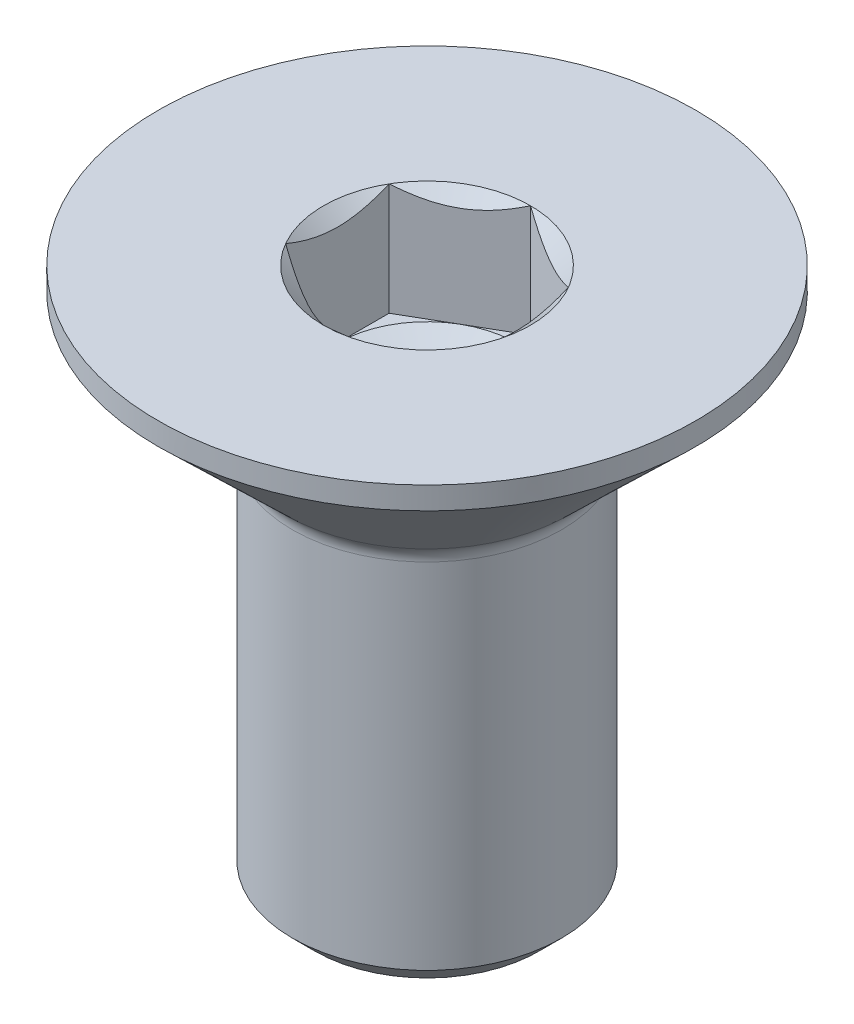
ISO-10303-21;
HEADER;
FILE_DESCRIPTION(('STEP AP214'),'2;1');
FILE_NAME('part.step','',(''),(''),'','','');
FILE_SCHEMA(('AUTOMOTIVE_DESIGN { 1 0 10303 214 1 1 1 1 }'));
ENDSEC;
DATA;
#1=APPLICATION_CONTEXT('core data for automotive mechanical design processes');
#2=APPLICATION_PROTOCOL_DEFINITION('international standard','automotive_design',2000,#1);
#3=PRODUCT_CONTEXT('',#1,'mechanical');
#4=PRODUCT('Part','Part','',(#3));
#5=PRODUCT_RELATED_PRODUCT_CATEGORY('part','',(#4));
#6=PRODUCT_DEFINITION_FORMATION('','',#4);
#7=PRODUCT_DEFINITION_CONTEXT('part definition',#1,'design');
#8=PRODUCT_DEFINITION('design','',#6,#7);
#9=PRODUCT_DEFINITION_SHAPE('','',#8);
#10=(LENGTH_UNIT() NAMED_UNIT(*) SI_UNIT(.MILLI.,.METRE.));
#11=(NAMED_UNIT(*) PLANE_ANGLE_UNIT() SI_UNIT($,.RADIAN.));
#12=(NAMED_UNIT(*) SI_UNIT($,.STERADIAN.) SOLID_ANGLE_UNIT());
#13=UNCERTAINTY_MEASURE_WITH_UNIT(LENGTH_MEASURE(1.E-05),#10,'distance_accuracy_value','');
#14=(GEOMETRIC_REPRESENTATION_CONTEXT(3) GLOBAL_UNCERTAINTY_ASSIGNED_CONTEXT((#13)) GLOBAL_UNIT_ASSIGNED_CONTEXT((#10,
#11,#12)) REPRESENTATION_CONTEXT('',''));
#15=CARTESIAN_POINT('',(0.,0.,0.));
#16=DIRECTION('',(0.,0.,1.));
#17=DIRECTION('',(1.,0.,0.));
#18=AXIS2_PLACEMENT_3D('',#15,#16,#17);
#19=CARTESIAN_POINT('',(0.,0.,0.));
#20=DIRECTION('',(0.,-1.,0.));
#21=DIRECTION('',(0.,0.,-1.));
#22=AXIS2_PLACEMENT_3D('',#19,#20,#21);
#23=PLANE('',#22);
#24=CARTESIAN_POINT('',(0.,0.,0.));
#25=DIRECTION('',(0.,1.,0.));
#26=DIRECTION('',(0.,0.,1.));
#27=AXIS2_PLACEMENT_3D('',#24,#25,#26);
#28=CIRCLE('',#27,2.31);
#29=CARTESIAN_POINT('',(0.,0.,2.31));
#30=VERTEX_POINT('',#29);
#31=EDGE_CURVE('E128',#30,#30,#28,.T.);
#32=ORIENTED_EDGE('',*,*,#31,.F.);
#33=EDGE_LOOP('',(#32));
#34=FACE_BOUND('',#33,.T.);
#35=CARTESIAN_POINT('',(0.,0.,0.));
#36=DIRECTION('',(0.,-1.,0.));
#37=DIRECTION('',(0.,0.,-1.));
#38=AXIS2_PLACEMENT_3D('',#35,#36,#37);
#39=CIRCLE('',#38,6.);
#40=CARTESIAN_POINT('',(0.,0.,-6.));
#41=VERTEX_POINT('',#40);
#42=EDGE_CURVE('E174',#41,#41,#39,.T.);
#43=ORIENTED_EDGE('',*,*,#42,.F.);
#44=EDGE_LOOP('',(#43));
#45=FACE_BOUND('',#44,.T.);
#46=ADVANCED_FACE('F40',(#34,#45),#23,.F.);
#47=CARTESIAN_POINT('',(0.,0.,0.));
#48=DIRECTION('',(0.,-1.,0.));
#49=DIRECTION('',(0.,0.,-1.));
#50=AXIS2_PLACEMENT_3D('',#47,#48,#49);
#51=CYLINDRICAL_SURFACE('',#50,6.);
#52=CARTESIAN_POINT('',(0.,-0.500000000000001,0.));
#53=DIRECTION('',(0.,-1.,0.));
#54=DIRECTION('',(0.,0.,-1.));
#55=AXIS2_PLACEMENT_3D('',#52,#53,#54);
#56=CIRCLE('',#55,6.);
#57=CARTESIAN_POINT('',(0.,-0.500000000000001,-6.));
#58=VERTEX_POINT('',#57);
#59=EDGE_CURVE('E161',#58,#58,#56,.T.);
#60=ORIENTED_EDGE('',*,*,#59,.F.);
#61=EDGE_LOOP('',(#60));
#62=FACE_BOUND('',#61,.T.);
#63=ORIENTED_EDGE('',*,*,#42,.T.);
#64=EDGE_LOOP('',(#63));
#65=FACE_BOUND('',#64,.T.);
#66=ADVANCED_FACE('F261',(#62,#65),#51,.T.);
#67=CARTESIAN_POINT('',(0.,-0.500000000000001,0.));
#68=DIRECTION('',(0.,1.,0.));
#69=DIRECTION('',(0.,0.,1.));
#70=AXIS2_PLACEMENT_3D('',#67,#68,#69);
#71=CONICAL_SURFACE('',#70,6.,0.802851455917386);
#72=CARTESIAN_POINT('',(0.,-3.24963383235673,0.));
#73=DIRECTION('',(0.,1.,0.));
#74=DIRECTION('',(0.,0.,1.));
#75=AXIS2_PLACEMENT_3D('',#72,#73,#74);
#76=CIRCLE('',#75,3.1526708147705);
#77=CARTESIAN_POINT('',(0.,-3.24963383235673,3.1526708147705));
#78=VERTEX_POINT('',#77);
#79=EDGE_CURVE('E282',#78,#78,#76,.T.);
#80=ORIENTED_EDGE('',*,*,#79,.T.);
#81=EDGE_LOOP('',(#80));
#82=FACE_BOUND('',#81,.T.);
#83=ORIENTED_EDGE('',*,*,#59,.T.);
#84=EDGE_LOOP('',(#83));
#85=FACE_BOUND('',#84,.T.);
#86=ADVANCED_FACE('F267',(#82,#85),#71,.T.);
#87=CARTESIAN_POINT('',(0.,0.,0.));
#88=DIRECTION('',(0.,-1.,0.));
#89=DIRECTION('',(0.,0.,-1.));
#90=AXIS2_PLACEMENT_3D('',#87,#88,#89);
#91=CYLINDRICAL_SURFACE('',#90,3.);
#92=CARTESIAN_POINT('',(0.,-11.5,0.));
#93=DIRECTION('',(0.,1.,0.));
#94=DIRECTION('',(0.,0.,1.));
#95=AXIS2_PLACEMENT_3D('',#92,#93,#94);
#96=CIRCLE('',#95,3.);
#97=CARTESIAN_POINT('',(0.,-11.5,3.));
#98=VERTEX_POINT('',#97);
#99=EDGE_CURVE('E11',#98,#98,#96,.T.);
#100=ORIENTED_EDGE('',*,*,#99,.T.);
#101=EDGE_LOOP('',(#100));
#102=FACE_BOUND('',#101,.T.);
#103=CARTESIAN_POINT('',(0.,-3.60930373252606,0.));
#104=DIRECTION('',(0.,-1.,0.));
#105=DIRECTION('',(0.,0.,-1.));
#106=AXIS2_PLACEMENT_3D('',#103,#104,#105);
#107=CIRCLE('',#106,3.);
#108=CARTESIAN_POINT('',(0.,-3.60930373252606,-3.));
#109=VERTEX_POINT('',#108);
#110=EDGE_CURVE('E184',#109,#109,#107,.T.);
#111=ORIENTED_EDGE('',*,*,#110,.T.);
#112=EDGE_LOOP('',(#111));
#113=FACE_BOUND('',#112,.T.);
#114=ADVANCED_FACE('F292',(#102,#113),#91,.T.);
#115=CARTESIAN_POINT('',(-3.,-12.,0.));
#116=DIRECTION('',(0.,1.,0.));
#117=DIRECTION('',(0.,0.,1.));
#118=AXIS2_PLACEMENT_3D('',#115,#116,#117);
#119=PLANE('',#118);
#120=CARTESIAN_POINT('',(0.,-12.,0.));
#121=DIRECTION('',(0.,1.,0.));
#122=DIRECTION('',(0.,0.,1.));
#123=AXIS2_PLACEMENT_3D('',#120,#121,#122);
#124=CIRCLE('',#123,2.5);
#125=CARTESIAN_POINT('',(0.,-12.,2.5));
#126=VERTEX_POINT('',#125);
#127=EDGE_CURVE('E49',#126,#126,#124,.F.);
#128=ORIENTED_EDGE('',*,*,#127,.T.);
#129=EDGE_LOOP('',(#128));
#130=FACE_BOUND('',#129,.T.);
#131=ADVANCED_FACE('F194',(#130),#119,.F.);
#132=CARTESIAN_POINT('',(0.,0.,0.));
#133=DIRECTION('',(0.,1.,0.));
#134=DIRECTION('',(0.,0.,1.));
#135=AXIS2_PLACEMENT_3D('',#132,#133,#134);
#136=CONICAL_SURFACE('',#135,2.31,0.872664625997163);
#137=ORIENTED_EDGE('',*,*,#31,.T.);
#138=EDGE_LOOP('',(#137));
#139=FACE_BOUND('',#138,.T.);
#140=CARTESIAN_POINT('',(-2.0002,-0.000405658125004433,1.15458506832541));
#141=CARTESIAN_POINT('',(-1.93287475094144,-0.0330095781407986,1.19345531899263));
#142=CARTESIAN_POINT('',(-1.86472971647742,-0.0635756724591018,1.23279887298437));
#143=CARTESIAN_POINT('',(-1.72660712740608,-0.119456092610079,1.31254398696588));
#144=CARTESIAN_POINT('',(-1.65662434741183,-0.144753068593469,1.3529485638342));
#145=CARTESIAN_POINT('',(-1.51571866742109,-0.188489926028671,1.4343004961072));
#146=CARTESIAN_POINT('',(-1.44481025262435,-0.206990500953071,1.4752394884779));
#147=CARTESIAN_POINT('',(-1.30186028885634,-0.236167725831299,1.55777168854001));
#148=CARTESIAN_POINT('',(-1.22982023312787,-0.246853924869292,1.59936403410728));
#149=CARTESIAN_POINT('',(-1.0839081689999,-0.259651331980527,1.68360640360958));
#150=CARTESIAN_POINT('',(-1.01002594981363,-0.261612076482138,1.7262623227451));
#151=CARTESIAN_POINT('',(-0.862481355207968,-0.256357289574613,1.81144723415815));
#152=CARTESIAN_POINT('',(-0.788819091111622,-0.249137710941465,1.85397616216329));
#153=CARTESIAN_POINT('',(-0.642524118308169,-0.226181336942714,1.93843960409246));
#154=CARTESIAN_POINT('',(-0.569891412688498,-0.210444516041176,1.98037411623394));
#155=CARTESIAN_POINT('',(-0.426099536377414,-0.17166610345073,2.06339239472943));
#156=CARTESIAN_POINT('',(-0.354941007253609,-0.148621399648175,2.1044757906742));
#157=CARTESIAN_POINT('',(-0.236290739707517,-0.104738038853124,2.17297855458135));
#158=CARTESIAN_POINT('',(-0.188354292269175,-0.0854616753332946,2.20065467541387));
#159=CARTESIAN_POINT('',(-0.0934234004944906,-0.0445838493235726,2.2554630513344));
#160=CARTESIAN_POINT('',(-0.0464262009270026,-0.022990946362807,2.28259689715585));
#161=CARTESIAN_POINT('',(0.000200000000027821,-0.000405658125105898,2.30951654681236));
#162=B_SPLINE_CURVE_WITH_KNOTS('',3,(#140,#141,#142,#143,#144,#145,#146,#147,#148,#149,#150,
#151,#152,#153,#154,#155,#156,#157,#158,#159,#160,#161),.UNSPECIFIED.,.F.,.F.,(4,2,2,2,2,2,2,2,
2,2,4),(0.,0.253000866314928,0.506822070483019,0.758318072154043,1.00950623246608,
1.2650095573224,1.52062556206819,1.77624233319228,2.03196810704139,2.20775392381176,
2.38291123945846),.UNSPECIFIED.);
#163=CARTESIAN_POINT('',(-2.,-0.00050255627104479,1.15470053837925));
#164=VERTEX_POINT('',#163);
#165=CARTESIAN_POINT('',(0.,-0.000502556271044343,2.3094010767585));
#166=VERTEX_POINT('',#165);
#167=EDGE_CURVE('E217',#164,#166,#162,.T.);
#168=ORIENTED_EDGE('',*,*,#167,.F.);
#169=CARTESIAN_POINT('',(-2.,1.42884136912728,-3.47890488615756));
#170=CARTESIAN_POINT('',(-2.,1.34383784002477,-3.36198935419755));
#171=CARTESIAN_POINT('',(-2.,1.25946562552995,-3.24460158772741));
#172=CARTESIAN_POINT('',(-2.,1.09251673958674,-3.00845232159265));
#173=CARTESIAN_POINT('',(-2.,1.0099411791052,-2.88969003782471));
#174=CARTESIAN_POINT('',(-2.,0.842987100749887,-2.64427692856581));
#175=CARTESIAN_POINT('',(-2.,0.758738482512587,-2.51753727508831));
#176=CARTESIAN_POINT('',(-2.,0.594062136943071,-2.26162364876202));
#177=CARTESIAN_POINT('',(-2.,0.513633452735371,-2.13245029698778));
#178=CARTESIAN_POINT('',(-2.,0.358016091222403,-1.87028891857478));
#179=CARTESIAN_POINT('',(-2.,0.282848711244451,-1.73728815327162));
#180=CARTESIAN_POINT('',(-2.,0.140834225934501,-1.46659435801191));
#181=CARTESIAN_POINT('',(-2.,0.0739963282907944,-1.32889634593875));
#182=CARTESIAN_POINT('',(-2.,-0.0156240795056579,-1.1197610729532));
#183=CARTESIAN_POINT('',(-2.,-0.0434434617845949,-1.05048990390851));
#184=CARTESIAN_POINT('',(-2.,-0.0951627305639261,-0.910474599859307));
#185=CARTESIAN_POINT('',(-2.,-0.119062239058122,-0.839730323538723));
#186=CARTESIAN_POINT('',(-2.,-0.162015759690175,-0.696965221013769));
#187=CARTESIAN_POINT('',(-2.,-0.181082115130939,-0.62494815956037));
#188=CARTESIAN_POINT('',(-2.,-0.213530543822554,-0.479663688822512));
#189=CARTESIAN_POINT('',(-2.,-0.226915469126224,-0.406396926142935));
#190=CARTESIAN_POINT('',(-2.,-0.248207044817011,-0.251712538215383));
#191=CARTESIAN_POINT('',(-2.,-0.25544750416034,-0.170200374129012));
#192=CARTESIAN_POINT('',(-2.,-0.26150785060429,-0.00685365619545706));
#193=CARTESIAN_POINT('',(-2.,-0.260327332124292,0.0749809129900447));
#194=CARTESIAN_POINT('',(-2.,-0.249629928206385,0.238392939894142));
#195=CARTESIAN_POINT('',(-2.,-0.240082440695584,0.319968349370142));
#196=CARTESIAN_POINT('',(-2.,-0.21338938373544,0.481853646739431));
#197=CARTESIAN_POINT('',(-2.,-0.196241879568789,0.562163206994297));
#198=CARTESIAN_POINT('',(-2.,-0.145736850275507,0.759207540378743));
#199=CARTESIAN_POINT('',(-2.,-0.108549130230999,0.874951900557049));
#200=CARTESIAN_POINT('',(-2.,-0.0239058600067478,1.10260962747161));
#201=CARTESIAN_POINT('',(-2.,0.0235598353258809,1.21451908153173));
#202=CARTESIAN_POINT('',(-2.,0.126199638300027,1.43602356741974));
#203=CARTESIAN_POINT('',(-2.,0.181444608973065,1.54558525042221));
#204=CARTESIAN_POINT('',(-2.,0.297090375927768,1.76185641556556));
#205=CARTESIAN_POINT('',(-2.,0.357489005146713,1.86856707199062));
#206=CARTESIAN_POINT('',(-2.,0.497538965732064,2.10616377702059));
#207=CARTESIAN_POINT('',(-2.,0.57823147229585,2.23643202919733));
#208=CARTESIAN_POINT('',(-2.,0.743573557452137,2.49445789741069));
#209=CARTESIAN_POINT('',(-2.,0.828224204652483,2.62221482206816));
#210=CARTESIAN_POINT('',(-2.,0.997865444974068,2.87223713301826));
#211=CARTESIAN_POINT('',(-2.,1.08277833262734,2.99455551226823));
#212=CARTESIAN_POINT('',(-2.,1.25452118355681,3.23771611889464));
#213=CARTESIAN_POINT('',(-2.,1.34134979637811,3.35855929837634));
#214=CARTESIAN_POINT('',(-2.,1.42884136912727,3.47890488615756));
#215=B_SPLINE_CURVE_WITH_KNOTS('',3,(#169,#170,#171,#172,#173,#174,#175,#176,#177,#178,#179,
#180,#181,#182,#183,#184,#185,#186,#187,#188,#189,#190,#191,#192,#193,#194,#195,#196,#197,#198,
#199,#200,#201,#202,#203,#204,#205,#206,#207,#208,#209,#210,#211,#212,#213,#214),.UNSPECIFIED.,
.F.,.F.,(4,2,2,2,2,2,2,2,2,2,2,2,2,2,2,2,2,2,2,2,2,2,4),(0.,0.433665424759704,0.86759179566553,
1.3241059282744,1.78050509651411,2.23865603748475,2.69730902414555,2.92116305046455,
3.1450386510805,3.36833660490576,3.59152233119441,3.83660150247801,4.08169247762035,
4.32768362845525,4.57373743664443,4.93772255085633,5.30206859763893,5.66997874286225,
6.03773494074744,6.49733214724377,6.95705415914102,7.40374015680396,7.85012074247862),.UNSPECIFIED.);
#216=CARTESIAN_POINT('',(-2.,-0.000502556271044633,-1.15470053837925));
#217=VERTEX_POINT('',#216);
#218=EDGE_CURVE('E56',#217,#164,#215,.T.);
#219=ORIENTED_EDGE('',*,*,#218,.F.);
#220=CARTESIAN_POINT('',(0.000200000000000059,-0.000405658125004177,-2.30951654681234));
#221=CARTESIAN_POINT('',(-0.0671252490585628,-0.0330095781407983,-2.27064629614512));
#222=CARTESIAN_POINT('',(-0.135270283522582,-0.0635756724591017,-2.23130274215338));
#223=CARTESIAN_POINT('',(-0.273392872593922,-0.119456092610079,-2.15155762817188));
#224=CARTESIAN_POINT('',(-0.343375652588173,-0.144753068593469,-2.11115305130356));
#225=CARTESIAN_POINT('',(-0.484281332578911,-0.188489926028671,-2.02980111903056));
#226=CARTESIAN_POINT('',(-0.555189747375652,-0.206990500953071,-1.98886212665985));
#227=CARTESIAN_POINT('',(-0.698139711143656,-0.236167725831299,-1.90632992659775));
#228=CARTESIAN_POINT('',(-0.770179766872132,-0.246853924869291,-1.86473758103048));
#229=CARTESIAN_POINT('',(-0.916091831000098,-0.259651331980526,-1.78049521152818));
#230=CARTESIAN_POINT('',(-0.989974050186368,-0.261612076482139,-1.73783929239266));
#231=CARTESIAN_POINT('',(-1.13751864479203,-0.256357289574613,-1.65265438097961));
#232=CARTESIAN_POINT('',(-1.21118090888838,-0.249137710941465,-1.61012545297446));
#233=CARTESIAN_POINT('',(-1.35747588169183,-0.226181336942714,-1.5256620110453));
#234=CARTESIAN_POINT('',(-1.4301085873115,-0.210444516041176,-1.48372749890381));
#235=CARTESIAN_POINT('',(-1.57390046362259,-0.17166610345073,-1.40070922040833));
#236=CARTESIAN_POINT('',(-1.64505899274639,-0.148621399648176,-1.35962582446356));
#237=CARTESIAN_POINT('',(-1.76370926029248,-0.104738038853124,-1.2911230605564));
#238=CARTESIAN_POINT('',(-1.81164570773083,-0.0854616753332948,-1.26344693972388));
#239=CARTESIAN_POINT('',(-1.90657659950551,-0.0445838493235729,-1.20863856380336));
#240=CARTESIAN_POINT('',(-1.953573799073,-0.0229909463628074,-1.18150471798191));
#241=CARTESIAN_POINT('',(-2.00020000000003,-0.000405658125106367,-1.1545850683254));
#242=B_SPLINE_CURVE_WITH_KNOTS('',3,(#220,#221,#222,#223,#224,#225,#226,#227,#228,#229,#230,
#231,#232,#233,#234,#235,#236,#237,#238,#239,#240,#241),.UNSPECIFIED.,.F.,.F.,(4,2,2,2,2,2,2,2,
2,2,4),(0.,0.253000866314929,0.506822070483019,0.758318072154043,1.00950623246608,
1.2650095573224,1.52062556206819,1.77624233319228,2.03196810704139,2.20775392381176,
2.38291123945846),.UNSPECIFIED.);
#243=CARTESIAN_POINT('',(0.,-0.000502556271044336,-2.3094010767585));
#244=VERTEX_POINT('',#243);
#245=EDGE_CURVE('E138',#244,#217,#242,.T.);
#246=ORIENTED_EDGE('',*,*,#245,.F.);
#247=CARTESIAN_POINT('',(2.0002,-0.000405658125004795,-1.15458506832541));
#248=CARTESIAN_POINT('',(1.93287475094144,-0.0330095781407987,-1.19345531899263));
#249=CARTESIAN_POINT('',(1.86472971647742,-0.0635756724591018,-1.23279887298437));
#250=CARTESIAN_POINT('',(1.72660712740608,-0.119456092610079,-1.31254398696588));
#251=CARTESIAN_POINT('',(1.65662434741183,-0.144753068593469,-1.3529485638342));
#252=CARTESIAN_POINT('',(1.51571866742109,-0.188489926028671,-1.4343004961072));
#253=CARTESIAN_POINT('',(1.44481025262435,-0.206990500953071,-1.47523948847791));
#254=CARTESIAN_POINT('',(1.30186028885634,-0.236167725831299,-1.55777168854001));
#255=CARTESIAN_POINT('',(1.22982023312787,-0.246853924869291,-1.59936403410728));
#256=CARTESIAN_POINT('',(1.0839081689999,-0.259651331980526,-1.68360640360958));
#257=CARTESIAN_POINT('',(1.01002594981363,-0.261612076482138,-1.7262623227451));
#258=CARTESIAN_POINT('',(0.862481355207967,-0.256357289574612,-1.81144723415815));
#259=CARTESIAN_POINT('',(0.788819091111622,-0.249137710941465,-1.85397616216329));
#260=CARTESIAN_POINT('',(0.642524118308169,-0.226181336942714,-1.93843960409246));
#261=CARTESIAN_POINT('',(0.569891412688498,-0.210444516041176,-1.98037411623394));
#262=CARTESIAN_POINT('',(0.426099536377414,-0.17166610345073,-2.06339239472943));
#263=CARTESIAN_POINT('',(0.354941007253609,-0.148621399648175,-2.1044757906742));
#264=CARTESIAN_POINT('',(0.236290739707517,-0.104738038853124,-2.17297855458135));
#265=CARTESIAN_POINT('',(0.188354292269175,-0.0854616753332948,-2.20065467541387));
#266=CARTESIAN_POINT('',(0.0934234004944905,-0.0445838493235729,-2.2554630513344));
#267=CARTESIAN_POINT('',(0.0464262009270024,-0.0229909463628073,-2.28259689715585));
#268=CARTESIAN_POINT('',(-0.000200000000028158,-0.000405658125106044,-2.30951654681236));
#269=B_SPLINE_CURVE_WITH_KNOTS('',3,(#247,#248,#249,#250,#251,#252,#253,#254,#255,#256,#257,
#258,#259,#260,#261,#262,#263,#264,#265,#266,#267,#268),.UNSPECIFIED.,.F.,.F.,(4,2,2,2,2,2,2,2,
2,2,4),(0.,0.253000866314928,0.506822070483018,0.758318072154043,1.00950623246608,
1.2650095573224,1.52062556206819,1.77624233319228,2.03196810704139,2.20775392381176,
2.38291123945846),.UNSPECIFIED.);
#270=CARTESIAN_POINT('',(2.,-0.000502556271044776,-1.15470053837925));
#271=VERTEX_POINT('',#270);
#272=EDGE_CURVE('E211',#271,#244,#269,.T.);
#273=ORIENTED_EDGE('',*,*,#272,.F.);
#274=CARTESIAN_POINT('',(2.,1.42884136912728,3.47890488615756));
#275=CARTESIAN_POINT('',(2.,1.34383784002477,3.36198935419755));
#276=CARTESIAN_POINT('',(2.,1.25946562552996,3.24460158772742));
#277=CARTESIAN_POINT('',(2.,1.09251673958674,3.00845232159265));
#278=CARTESIAN_POINT('',(2.,1.0099411791052,2.88969003782471));
#279=CARTESIAN_POINT('',(2.,0.842987100749888,2.64427692856582));
#280=CARTESIAN_POINT('',(2.,0.758738482512587,2.51753727508831));
#281=CARTESIAN_POINT('',(2.,0.594062136943072,2.26162364876202));
#282=CARTESIAN_POINT('',(2.,0.513633452735372,2.13245029698778));
#283=CARTESIAN_POINT('',(2.,0.358016091222403,1.87028891857478));
#284=CARTESIAN_POINT('',(2.,0.282848711244451,1.73728815327162));
#285=CARTESIAN_POINT('',(2.,0.140834225934501,1.46659435801191));
#286=CARTESIAN_POINT('',(2.,0.0739963282907947,1.32889634593875));
#287=CARTESIAN_POINT('',(2.,-0.015624079505658,1.1197610729532));
#288=CARTESIAN_POINT('',(2.,-0.0434434617845952,1.05048990390851));
#289=CARTESIAN_POINT('',(2.,-0.0951627305639264,0.910474599859307));
#290=CARTESIAN_POINT('',(2.,-0.119062239058122,0.839730323538723));
#291=CARTESIAN_POINT('',(2.,-0.162015759690175,0.696965221013769));
#292=CARTESIAN_POINT('',(2.,-0.181082115130939,0.624948159560369));
#293=CARTESIAN_POINT('',(2.,-0.213530543822554,0.479663688822512));
#294=CARTESIAN_POINT('',(2.,-0.226915469126224,0.406396926142935));
#295=CARTESIAN_POINT('',(2.,-0.248207044817011,0.251712538215382));
#296=CARTESIAN_POINT('',(2.,-0.25544750416034,0.170200374129011));
#297=CARTESIAN_POINT('',(2.,-0.26150785060429,0.00685365619545654));
#298=CARTESIAN_POINT('',(2.,-0.260327332124292,-0.0749809129900453));
#299=CARTESIAN_POINT('',(2.,-0.249629928206385,-0.238392939894143));
#300=CARTESIAN_POINT('',(2.,-0.240082440695584,-0.319968349370143));
#301=CARTESIAN_POINT('',(2.,-0.21338938373544,-0.481853646739432));
#302=CARTESIAN_POINT('',(2.,-0.196241879568789,-0.562163206994298));
#303=CARTESIAN_POINT('',(2.,-0.145736850275507,-0.759207540378743));
#304=CARTESIAN_POINT('',(2.,-0.108549130230999,-0.87495190055705));
#305=CARTESIAN_POINT('',(2.,-0.0239058600067477,-1.10260962747161));
#306=CARTESIAN_POINT('',(2.,0.0235598353258809,-1.21451908153173));
#307=CARTESIAN_POINT('',(2.,0.126199638300027,-1.43602356741974));
#308=CARTESIAN_POINT('',(2.,0.181444608973064,-1.54558525042221));
#309=CARTESIAN_POINT('',(2.,0.297090375927769,-1.76185641556556));
#310=CARTESIAN_POINT('',(2.,0.357489005146713,-1.86856707199062));
#311=CARTESIAN_POINT('',(2.,0.497538965732065,-2.10616377702059));
#312=CARTESIAN_POINT('',(2.,0.57823147229585,-2.23643202919733));
#313=CARTESIAN_POINT('',(2.,0.743573557452138,-2.49445789741069));
#314=CARTESIAN_POINT('',(2.,0.828224204652484,-2.62221482206817));
#315=CARTESIAN_POINT('',(2.,0.997865444974069,-2.87223713301826));
#316=CARTESIAN_POINT('',(2.,1.08277833262734,-2.99455551226823));
#317=CARTESIAN_POINT('',(2.,1.25452118355681,-3.23771611889464));
#318=CARTESIAN_POINT('',(2.,1.34134979637811,-3.35855929837634));
#319=CARTESIAN_POINT('',(2.,1.42884136912728,-3.47890488615756));
#320=B_SPLINE_CURVE_WITH_KNOTS('',3,(#274,#275,#276,#277,#278,#279,#280,#281,#282,#283,#284,
#285,#286,#287,#288,#289,#290,#291,#292,#293,#294,#295,#296,#297,#298,#299,#300,#301,#302,#303,
#304,#305,#306,#307,#308,#309,#310,#311,#312,#313,#314,#315,#316,#317,#318,#319),.UNSPECIFIED.,
.F.,.F.,(4,2,2,2,2,2,2,2,2,2,2,2,2,2,2,2,2,2,2,2,2,2,4),(0.,0.433665424759705,0.86759179566553,
1.3241059282744,1.78050509651412,2.23865603748475,2.69730902414556,2.92116305046456,
3.1450386510805,3.36833660490576,3.59152233119442,3.83660150247801,4.08169247762036,
4.32768362845526,4.57373743664444,4.93772255085633,5.30206859763893,5.66997874286225,
6.03773494074744,6.49733214724377,6.95705415914102,7.40374015680396,7.85012074247862),.UNSPECIFIED.);
#321=CARTESIAN_POINT('',(2.,-0.000502556271044359,1.15470053837925));
#322=VERTEX_POINT('',#321);
#323=EDGE_CURVE('E224',#322,#271,#320,.T.);
#324=ORIENTED_EDGE('',*,*,#323,.F.);
#325=CARTESIAN_POINT('',(-0.000200000000000382,-0.000405658125004177,2.30951654681234));
#326=CARTESIAN_POINT('',(0.0671252490585623,-0.0330095781407984,2.27064629614512));
#327=CARTESIAN_POINT('',(0.135270283522581,-0.0635756724591017,2.23130274215338));
#328=CARTESIAN_POINT('',(0.273392872593922,-0.119456092610079,2.15155762817188));
#329=CARTESIAN_POINT('',(0.343375652588173,-0.144753068593468,2.11115305130356));
#330=CARTESIAN_POINT('',(0.484281332578911,-0.188489926028671,2.02980111903056));
#331=CARTESIAN_POINT('',(0.555189747375652,-0.206990500953071,1.98886212665985));
#332=CARTESIAN_POINT('',(0.698139711143655,-0.236167725831299,1.90632992659775));
#333=CARTESIAN_POINT('',(0.770179766872131,-0.246853924869291,1.86473758103048));
#334=CARTESIAN_POINT('',(0.916091831000098,-0.259651331980526,1.78049521152818));
#335=CARTESIAN_POINT('',(0.989974050186367,-0.261612076482138,1.73783929239266));
#336=CARTESIAN_POINT('',(1.13751864479203,-0.256357289574613,1.65265438097961));
#337=CARTESIAN_POINT('',(1.21118090888838,-0.249137710941465,1.61012545297446));
#338=CARTESIAN_POINT('',(1.35747588169183,-0.226181336942714,1.5256620110453));
#339=CARTESIAN_POINT('',(1.4301085873115,-0.210444516041176,1.48372749890381));
#340=CARTESIAN_POINT('',(1.57390046362259,-0.17166610345073,1.40070922040833));
#341=CARTESIAN_POINT('',(1.64505899274639,-0.148621399648175,1.35962582446356));
#342=CARTESIAN_POINT('',(1.76370926029248,-0.104738038853124,1.2911230605564));
#343=CARTESIAN_POINT('',(1.81164570773082,-0.085461675333295,1.26344693972388));
#344=CARTESIAN_POINT('',(1.90657659950551,-0.044583849323573,1.20863856380336));
#345=CARTESIAN_POINT('',(1.953573799073,-0.0229909463628073,1.18150471798191));
#346=CARTESIAN_POINT('',(2.00020000000003,-0.000405658125105825,1.1545850683254));
#347=B_SPLINE_CURVE_WITH_KNOTS('',3,(#325,#326,#327,#328,#329,#330,#331,#332,#333,#334,#335,
#336,#337,#338,#339,#340,#341,#342,#343,#344,#345,#346),.UNSPECIFIED.,.F.,.F.,(4,2,2,2,2,2,2,2,
2,2,4),(0.,0.253000866314929,0.506822070483019,0.758318072154043,1.00950623246608,
1.2650095573224,1.52062556206819,1.77624233319228,2.03196810704139,2.20775392381176,
2.38291123945846),.UNSPECIFIED.);
#348=EDGE_CURVE('E229',#166,#322,#347,.T.);
#349=ORIENTED_EDGE('',*,*,#348,.F.);
#350=EDGE_LOOP('',(#168,#219,#246,#273,#324,#349));
#351=FACE_BOUND('',#350,.T.);
#352=ADVANCED_FACE('F190',(#139,#351),#136,.F.);
#353=CARTESIAN_POINT('',(0.,-2.5,0.));
#354=DIRECTION('',(0.,1.,0.));
#355=DIRECTION('',(0.,0.,1.));
#356=AXIS2_PLACEMENT_3D('',#353,#354,#355);
#357=PLANE('',#356);
#358=CARTESIAN_POINT('',(0.,-2.5,0.));
#359=DIRECTION('',(0.,1.,0.));
#360=DIRECTION('',(0.,0.,1.));
#361=AXIS2_PLACEMENT_3D('',#358,#359,#360);
#362=CIRCLE('',#361,2.);
#363=CARTESIAN_POINT('',(2.,-2.5,0.));
#364=VERTEX_POINT('',#363);
#365=CARTESIAN_POINT('',(1.,-2.5,-1.73205080756888));
#366=VERTEX_POINT('',#365);
#367=EDGE_CURVE('E122',#364,#366,#362,.T.);
#368=ORIENTED_EDGE('',*,*,#367,.F.);
#369=DIRECTION('',(0.,0.,-1.));
#370=VECTOR('',#369,1.);
#371=CARTESIAN_POINT('',(2.,-2.5,1.15470053837925));
#372=LINE('',#371,#370);
#373=CARTESIAN_POINT('',(2.,-2.5,-1.15470053837925));
#374=VERTEX_POINT('',#373);
#375=EDGE_CURVE('E134',#364,#374,#372,.T.);
#376=ORIENTED_EDGE('',*,*,#375,.T.);
#377=DIRECTION('',(-0.866025403784438,0.,-0.5));
#378=VECTOR('',#377,1.);
#379=CARTESIAN_POINT('',(2.,-2.5,-1.15470053837925));
#380=LINE('',#379,#378);
#381=EDGE_CURVE('E137',#374,#366,#380,.T.);
#382=ORIENTED_EDGE('',*,*,#381,.T.);
#383=EDGE_LOOP('',(#368,#376,#382));
#384=FACE_BOUND('',#383,.T.);
#385=ADVANCED_FACE('F133',(#384),#357,.T.);
#386=CARTESIAN_POINT('',(2.,-2.5,1.15470053837925));
#387=DIRECTION('',(1.,0.,0.));
#388=DIRECTION('',(0.,0.,-1.));
#389=AXIS2_PLACEMENT_3D('',#386,#387,#388);
#390=PLANE('',#389);
#391=ORIENTED_EDGE('',*,*,#375,.F.);
#392=CARTESIAN_POINT('',(2.,-2.5,1.15470053837925));
#393=VERTEX_POINT('',#392);
#394=EDGE_CURVE('E145',#393,#364,#372,.T.);
#395=ORIENTED_EDGE('',*,*,#394,.F.);
#396=DIRECTION('',(0.,1.,0.));
#397=VECTOR('',#396,1.);
#398=CARTESIAN_POINT('',(2.,-2.5,1.15470053837925));
#399=LINE('',#398,#397);
#400=EDGE_CURVE('E162',#393,#322,#399,.T.);
#401=ORIENTED_EDGE('',*,*,#400,.T.);
#402=ORIENTED_EDGE('',*,*,#323,.T.);
#403=DIRECTION('',(0.,1.,0.));
#404=VECTOR('',#403,1.);
#405=CARTESIAN_POINT('',(2.,-2.5,-1.15470053837925));
#406=LINE('',#405,#404);
#407=EDGE_CURVE('E147',#374,#271,#406,.T.);
#408=ORIENTED_EDGE('',*,*,#407,.F.);
#409=EDGE_LOOP('',(#391,#395,#401,#402,#408));
#410=FACE_BOUND('',#409,.T.);
#411=ADVANCED_FACE('F143',(#410),#390,.F.);
#412=CARTESIAN_POINT('',(0.,-2.5,0.));
#413=DIRECTION('',(0.,1.,0.));
#414=DIRECTION('',(0.,0.,1.));
#415=AXIS2_PLACEMENT_3D('',#412,#413,#414);
#416=CIRCLE('',#415,2.);
#417=CARTESIAN_POINT('',(0.999999999999999,-2.5,1.73205080756888));
#418=VERTEX_POINT('',#417);
#419=EDGE_CURVE('E120',#418,#364,#416,.T.);
#420=ORIENTED_EDGE('',*,*,#419,.F.);
#421=DIRECTION('',(0.866025403784439,0.,-0.5));
#422=VECTOR('',#421,1.);
#423=CARTESIAN_POINT('',(0.,-2.5,2.3094010767585));
#424=LINE('',#423,#422);
#425=EDGE_CURVE('E151',#418,#393,#424,.T.);
#426=ORIENTED_EDGE('',*,*,#425,.T.);
#427=ORIENTED_EDGE('',*,*,#394,.T.);
#428=EDGE_LOOP('',(#420,#426,#427));
#429=FACE_BOUND('',#428,.T.);
#430=ADVANCED_FACE('F150',(#429),#357,.T.);
#431=CARTESIAN_POINT('',(0.,-2.5,2.3094010767585));
#432=DIRECTION('',(0.5,0.,0.866025403784439));
#433=DIRECTION('',(0.866025403784439,0.,-0.5));
#434=AXIS2_PLACEMENT_3D('',#431,#432,#433);
#435=PLANE('',#434);
#436=ORIENTED_EDGE('',*,*,#425,.F.);
#437=CARTESIAN_POINT('',(0.,-2.5,2.3094010767585));
#438=VERTEX_POINT('',#437);
#439=EDGE_CURVE('E148',#438,#418,#424,.T.);
#440=ORIENTED_EDGE('',*,*,#439,.F.);
#441=DIRECTION('',(0.,1.,0.));
#442=VECTOR('',#441,1.);
#443=CARTESIAN_POINT('',(0.,-2.5,2.3094010767585));
#444=LINE('',#443,#442);
#445=EDGE_CURVE('E164',#438,#166,#444,.T.);
#446=ORIENTED_EDGE('',*,*,#445,.T.);
#447=ORIENTED_EDGE('',*,*,#348,.T.);
#448=ORIENTED_EDGE('',*,*,#400,.F.);
#449=EDGE_LOOP('',(#436,#440,#446,#447,#448));
#450=FACE_BOUND('',#449,.T.);
#451=ADVANCED_FACE('F238',(#450),#435,.F.);
#452=CARTESIAN_POINT('',(-1.,-2.5,1.73205080756888));
#453=VERTEX_POINT('',#452);
#454=EDGE_CURVE('E124',#453,#418,#362,.T.);
#455=ORIENTED_EDGE('',*,*,#454,.F.);
#456=DIRECTION('',(0.866025403784438,0.,0.5));
#457=VECTOR('',#456,1.);
#458=CARTESIAN_POINT('',(-2.,-2.5,1.15470053837925));
#459=LINE('',#458,#457);
#460=EDGE_CURVE('E529',#453,#438,#459,.T.);
#461=ORIENTED_EDGE('',*,*,#460,.T.);
#462=ORIENTED_EDGE('',*,*,#439,.T.);
#463=EDGE_LOOP('',(#455,#461,#462));
#464=FACE_BOUND('',#463,.T.);
#465=ADVANCED_FACE('F196',(#464),#357,.T.);
#466=CARTESIAN_POINT('',(-2.,-2.5,1.15470053837925));
#467=DIRECTION('',(-0.5,0.,0.866025403784438));
#468=DIRECTION('',(0.866025403784439,0.,0.5));
#469=AXIS2_PLACEMENT_3D('',#466,#467,#468);
#470=PLANE('',#469);
#471=ORIENTED_EDGE('',*,*,#460,.F.);
#472=CARTESIAN_POINT('',(-2.,-2.5,1.15470053837925));
#473=VERTEX_POINT('',#472);
#474=EDGE_CURVE('E530',#473,#453,#459,.T.);
#475=ORIENTED_EDGE('',*,*,#474,.F.);
#476=DIRECTION('',(0.,1.,0.));
#477=VECTOR('',#476,1.);
#478=CARTESIAN_POINT('',(-2.,-2.5,1.15470053837925));
#479=LINE('',#478,#477);
#480=EDGE_CURVE('E167',#473,#164,#479,.T.);
#481=ORIENTED_EDGE('',*,*,#480,.T.);
#482=ORIENTED_EDGE('',*,*,#167,.T.);
#483=ORIENTED_EDGE('',*,*,#445,.F.);
#484=EDGE_LOOP('',(#471,#475,#481,#482,#483));
#485=FACE_BOUND('',#484,.T.);
#486=ADVANCED_FACE('F242',(#485),#470,.F.);
#487=CARTESIAN_POINT('',(-2.,-2.5,0.));
#488=VERTEX_POINT('',#487);
#489=EDGE_CURVE('E64',#488,#453,#362,.T.);
#490=ORIENTED_EDGE('',*,*,#489,.F.);
#491=DIRECTION('',(0.,0.,1.));
#492=VECTOR('',#491,1.);
#493=CARTESIAN_POINT('',(-2.,-2.5,-1.15470053837925));
#494=LINE('',#493,#492);
#495=EDGE_CURVE('E526',#488,#473,#494,.T.);
#496=ORIENTED_EDGE('',*,*,#495,.T.);
#497=ORIENTED_EDGE('',*,*,#474,.T.);
#498=EDGE_LOOP('',(#490,#496,#497));
#499=FACE_BOUND('',#498,.T.);
#500=ADVANCED_FACE('F245',(#499),#357,.T.);
#501=CARTESIAN_POINT('',(-2.,-2.5,-1.15470053837925));
#502=DIRECTION('',(-1.,0.,0.));
#503=DIRECTION('',(0.,0.,1.));
#504=AXIS2_PLACEMENT_3D('',#501,#502,#503);
#505=PLANE('',#504);
#506=ORIENTED_EDGE('',*,*,#495,.F.);
#507=CARTESIAN_POINT('',(-2.,-2.5,-1.15470053837925));
#508=VERTEX_POINT('',#507);
#509=EDGE_CURVE('E527',#508,#488,#494,.T.);
#510=ORIENTED_EDGE('',*,*,#509,.F.);
#511=DIRECTION('',(0.,1.,0.));
#512=VECTOR('',#511,1.);
#513=CARTESIAN_POINT('',(-2.,-2.5,-1.15470053837925));
#514=LINE('',#513,#512);
#515=EDGE_CURVE('E155',#508,#217,#514,.T.);
#516=ORIENTED_EDGE('',*,*,#515,.T.);
#517=ORIENTED_EDGE('',*,*,#218,.T.);
#518=ORIENTED_EDGE('',*,*,#480,.F.);
#519=EDGE_LOOP('',(#506,#510,#516,#517,#518));
#520=FACE_BOUND('',#519,.T.);
#521=ADVANCED_FACE('F247',(#520),#505,.F.);
#522=CARTESIAN_POINT('',(-1.,-2.5,-1.73205080756888));
#523=VERTEX_POINT('',#522);
#524=EDGE_CURVE('E139',#366,#523,#362,.T.);
#525=ORIENTED_EDGE('',*,*,#524,.F.);
#526=CARTESIAN_POINT('',(0.,-2.5,-2.3094010767585));
#527=VERTEX_POINT('',#526);
#528=EDGE_CURVE('E519',#366,#527,#380,.T.);
#529=ORIENTED_EDGE('',*,*,#528,.T.);
#530=DIRECTION('',(-0.866025403784439,0.,0.5));
#531=VECTOR('',#530,1.);
#532=CARTESIAN_POINT('',(0.,-2.5,-2.3094010767585));
#533=LINE('',#532,#531);
#534=EDGE_CURVE('E524',#527,#523,#533,.T.);
#535=ORIENTED_EDGE('',*,*,#534,.T.);
#536=EDGE_LOOP('',(#525,#529,#535));
#537=FACE_BOUND('',#536,.T.);
#538=ADVANCED_FACE('F250',(#537),#357,.T.);
#539=EDGE_CURVE('E546',#523,#488,#362,.T.);
#540=ORIENTED_EDGE('',*,*,#539,.F.);
#541=EDGE_CURVE('E522',#523,#508,#533,.T.);
#542=ORIENTED_EDGE('',*,*,#541,.T.);
#543=ORIENTED_EDGE('',*,*,#509,.T.);
#544=EDGE_LOOP('',(#540,#542,#543));
#545=FACE_BOUND('',#544,.T.);
#546=ADVANCED_FACE('F256',(#545),#357,.T.);
#547=CARTESIAN_POINT('',(0.,-2.5,-2.3094010767585));
#548=DIRECTION('',(-0.5,0.,-0.866025403784439));
#549=DIRECTION('',(-0.866025403784439,0.,0.5));
#550=AXIS2_PLACEMENT_3D('',#547,#548,#549);
#551=PLANE('',#550);
#552=ORIENTED_EDGE('',*,*,#541,.F.);
#553=ORIENTED_EDGE('',*,*,#534,.F.);
#554=DIRECTION('',(0.,1.,0.));
#555=VECTOR('',#554,1.);
#556=CARTESIAN_POINT('',(0.,-2.5,-2.3094010767585));
#557=LINE('',#556,#555);
#558=EDGE_CURVE('E153',#527,#244,#557,.T.);
#559=ORIENTED_EDGE('',*,*,#558,.T.);
#560=ORIENTED_EDGE('',*,*,#245,.T.);
#561=ORIENTED_EDGE('',*,*,#515,.F.);
#562=EDGE_LOOP('',(#552,#553,#559,#560,#561));
#563=FACE_BOUND('',#562,.T.);
#564=ADVANCED_FACE('F186',(#563),#551,.F.);
#565=CARTESIAN_POINT('',(2.,-2.5,-1.15470053837925));
#566=DIRECTION('',(0.5,0.,-0.866025403784439));
#567=DIRECTION('',(-0.866025403784439,0.,-0.5));
#568=AXIS2_PLACEMENT_3D('',#565,#566,#567);
#569=PLANE('',#568);
#570=ORIENTED_EDGE('',*,*,#528,.F.);
#571=ORIENTED_EDGE('',*,*,#381,.F.);
#572=ORIENTED_EDGE('',*,*,#407,.T.);
#573=ORIENTED_EDGE('',*,*,#272,.T.);
#574=ORIENTED_EDGE('',*,*,#558,.F.);
#575=EDGE_LOOP('',(#570,#571,#572,#573,#574));
#576=FACE_BOUND('',#575,.T.);
#577=ADVANCED_FACE('F117',(#576),#569,.F.);
#578=CARTESIAN_POINT('',(0.,-2.5,0.));
#579=DIRECTION('',(0.,1.,0.));
#580=DIRECTION('',(0.,0.,1.));
#581=AXIS2_PLACEMENT_3D('',#578,#579,#580);
#582=CONICAL_SURFACE('',#581,2.,1.22173047639603);
#583=CARTESIAN_POINT('',(0.,-3.22794046853241,0.));
#584=VERTEX_POINT('',#583);
#585=VERTEX_LOOP('',#584);
#586=FACE_BOUND('',#585,.T.);
#587=ORIENTED_EDGE('',*,*,#419,.T.);
#588=ORIENTED_EDGE('',*,*,#367,.T.);
#589=ORIENTED_EDGE('',*,*,#524,.T.);
#590=ORIENTED_EDGE('',*,*,#539,.T.);
#591=ORIENTED_EDGE('',*,*,#489,.T.);
#592=ORIENTED_EDGE('',*,*,#454,.T.);
#593=EDGE_LOOP('',(#587,#588,#589,#590,#591,#592));
#594=FACE_BOUND('',#593,.T.);
#595=ADVANCED_FACE('F114',(#586,#594),#582,.F.);
#596=CARTESIAN_POINT('',(0.,-3.60930373252606,0.));
#597=DIRECTION('',(0.,-1.,0.));
#598=DIRECTION('',(0.,0.,-1.));
#599=AXIS2_PLACEMENT_3D('',#596,#597,#598);
#600=TOROIDAL_SURFACE('',#599,3.5,0.5);
#601=ORIENTED_EDGE('',*,*,#79,.F.);
#602=EDGE_LOOP('',(#601));
#603=FACE_BOUND('',#602,.T.);
#604=ORIENTED_EDGE('',*,*,#110,.F.);
#605=EDGE_LOOP('',(#604));
#606=FACE_BOUND('',#605,.T.);
#607=ADVANCED_FACE('F116',(#603,#606),#600,.F.);
#608=CARTESIAN_POINT('',(0.,-12.,0.));
#609=DIRECTION('',(0.,1.,0.));
#610=DIRECTION('',(0.,0.,1.));
#611=AXIS2_PLACEMENT_3D('',#608,#609,#610);
#612=CONICAL_SURFACE('',#611,2.5,0.785398163397447);
#613=ORIENTED_EDGE('',*,*,#99,.F.);
#614=EDGE_LOOP('',(#613));
#615=FACE_BOUND('',#614,.T.);
#616=ORIENTED_EDGE('',*,*,#127,.F.);
#617=EDGE_LOOP('',(#616));
#618=FACE_BOUND('',#617,.T.);
#619=ADVANCED_FACE('F43',(#615,#618),#612,.T.);
#620=CLOSED_SHELL('',(#46,#66,#86,#114,#131,#352,#385,#411,#430,#451,#465,#486,#500,#521,#538,
#546,#564,#577,#595,#607,#619));
#621=MANIFOLD_SOLID_BREP('B2',#620);
#622=ADVANCED_BREP_SHAPE_REPRESENTATION('',(#18,#621),#14);
#623=SHAPE_DEFINITION_REPRESENTATION(#9,#622);
ENDSEC;
END-ISO-10303-21;
